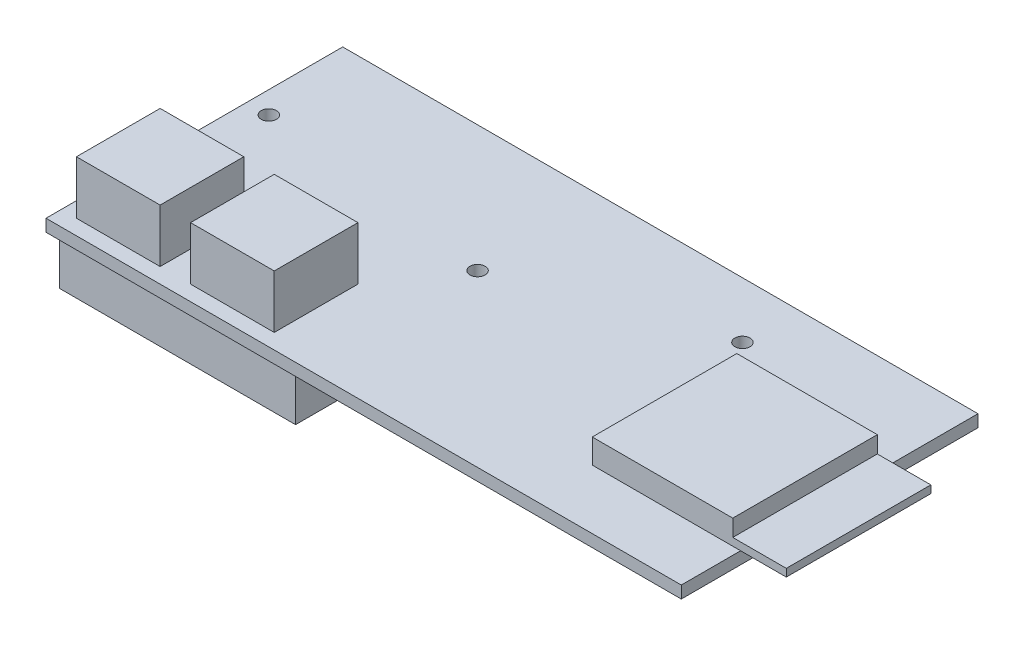
ISO-10303-21;
HEADER;
FILE_DESCRIPTION(('STEP AP214'),'2;1');
FILE_NAME('part.step','',(''),(''),'','','');
FILE_SCHEMA(('AUTOMOTIVE_DESIGN { 1 0 10303 214 1 1 1 1 }'));
ENDSEC;
DATA;
#1=APPLICATION_CONTEXT('core data for automotive mechanical design processes');
#2=APPLICATION_PROTOCOL_DEFINITION('international standard','automotive_design',2000,#1);
#3=PRODUCT_CONTEXT('',#1,'mechanical');
#4=PRODUCT('Part','Part','',(#3));
#5=PRODUCT_RELATED_PRODUCT_CATEGORY('part','',(#4));
#6=PRODUCT_DEFINITION_FORMATION('','',#4);
#7=PRODUCT_DEFINITION_CONTEXT('part definition',#1,'design');
#8=PRODUCT_DEFINITION('design','',#6,#7);
#9=PRODUCT_DEFINITION_SHAPE('','',#8);
#10=(LENGTH_UNIT() NAMED_UNIT(*) SI_UNIT(.MILLI.,.METRE.));
#11=(NAMED_UNIT(*) PLANE_ANGLE_UNIT() SI_UNIT($,.RADIAN.));
#12=(NAMED_UNIT(*) SI_UNIT($,.STERADIAN.) SOLID_ANGLE_UNIT());
#13=UNCERTAINTY_MEASURE_WITH_UNIT(LENGTH_MEASURE(1.E-05),#10,'distance_accuracy_value','');
#14=(GEOMETRIC_REPRESENTATION_CONTEXT(3) GLOBAL_UNCERTAINTY_ASSIGNED_CONTEXT((#13)) GLOBAL_UNIT_ASSIGNED_CONTEXT((#10,
#11,#12)) REPRESENTATION_CONTEXT('',''));
#15=CARTESIAN_POINT('',(0.,0.,0.));
#16=DIRECTION('',(0.,0.,1.));
#17=DIRECTION('',(1.,0.,0.));
#18=AXIS2_PLACEMENT_3D('',#15,#16,#17);
#19=CARTESIAN_POINT('',(0.,0.,0.));
#20=DIRECTION('',(0.,1.,0.));
#21=DIRECTION('',(0.,0.,1.));
#22=AXIS2_PLACEMENT_3D('',#19,#20,#21);
#23=PLANE('',#22);
#24=CARTESIAN_POINT('',(2.89,0.,12.6));
#25=DIRECTION('',(0.,1.,0.));
#26=DIRECTION('',(0.,0.,1.));
#27=AXIS2_PLACEMENT_3D('',#24,#25,#26);
#28=CIRCLE('',#27,1.);
#29=CARTESIAN_POINT('',(2.89,0.,13.6));
#30=VERTEX_POINT('',#29);
#31=EDGE_CURVE('E288',#30,#30,#28,.T.);
#32=ORIENTED_EDGE('',*,*,#31,.T.);
#33=EDGE_LOOP('',(#32));
#34=FACE_BOUND('',#33,.T.);
#35=CARTESIAN_POINT('',(34.32,0.,16.6));
#36=DIRECTION('',(0.,1.,0.));
#37=DIRECTION('',(0.,0.,1.));
#38=AXIS2_PLACEMENT_3D('',#35,#36,#37);
#39=CIRCLE('',#38,0.999999999999998);
#40=CARTESIAN_POINT('',(34.32,0.,17.6));
#41=VERTEX_POINT('',#40);
#42=EDGE_CURVE('E377',#41,#41,#39,.T.);
#43=ORIENTED_EDGE('',*,*,#42,.T.);
#44=EDGE_LOOP('',(#43));
#45=FACE_BOUND('',#44,.T.);
#46=CARTESIAN_POINT('',(59.9,0.,7.36));
#47=DIRECTION('',(0.,1.,0.));
#48=DIRECTION('',(0.,0.,1.));
#49=AXIS2_PLACEMENT_3D('',#46,#47,#48);
#50=CIRCLE('',#49,0.999999999999998);
#51=CARTESIAN_POINT('',(59.9,0.,8.36));
#52=VERTEX_POINT('',#51);
#53=EDGE_CURVE('E37',#52,#52,#50,.T.);
#54=ORIENTED_EDGE('',*,*,#53,.T.);
#55=EDGE_LOOP('',(#54));
#56=FACE_BOUND('',#55,.T.);
#57=DIRECTION('',(-1.,0.,0.));
#58=VECTOR('',#57,1.);
#59=CARTESIAN_POINT('',(-0.2,0.,37.));
#60=LINE('',#59,#58);
#61=CARTESIAN_POINT('',(30.8,0.,37.));
#62=VERTEX_POINT('',#61);
#63=CARTESIAN_POINT('',(0.,0.,37.));
#64=VERTEX_POINT('',#63);
#65=EDGE_CURVE('E51',#62,#64,#60,.T.);
#66=ORIENTED_EDGE('',*,*,#65,.F.);
#67=DIRECTION('',(0.,0.,1.));
#68=VECTOR('',#67,1.);
#69=CARTESIAN_POINT('',(30.8,0.,37.));
#70=LINE('',#69,#68);
#71=CARTESIAN_POINT('',(30.8,0.,22.));
#72=VERTEX_POINT('',#71);
#73=EDGE_CURVE('E714',#72,#62,#70,.T.);
#74=ORIENTED_EDGE('',*,*,#73,.F.);
#75=DIRECTION('',(1.,0.,0.));
#76=VECTOR('',#75,1.);
#77=CARTESIAN_POINT('',(-0.2,0.,22.));
#78=LINE('',#77,#76);
#79=CARTESIAN_POINT('',(0.,0.,22.));
#80=VERTEX_POINT('',#79);
#81=EDGE_CURVE('E11',#80,#72,#78,.T.);
#82=ORIENTED_EDGE('',*,*,#81,.F.);
#83=DIRECTION('',(0.,0.,1.));
#84=VECTOR('',#83,1.);
#85=CARTESIAN_POINT('',(0.,0.,0.));
#86=LINE('',#85,#84);
#87=CARTESIAN_POINT('',(0.,0.,0.));
#88=VERTEX_POINT('',#87);
#89=EDGE_CURVE('E356',#88,#80,#86,.T.);
#90=ORIENTED_EDGE('',*,*,#89,.F.);
#91=DIRECTION('',(-1.,0.,0.));
#92=VECTOR('',#91,1.);
#93=CARTESIAN_POINT('',(0.,0.,0.));
#94=LINE('',#93,#92);
#95=CARTESIAN_POINT('',(83.5,0.,0.));
#96=VERTEX_POINT('',#95);
#97=EDGE_CURVE('E347',#96,#88,#94,.T.);
#98=ORIENTED_EDGE('',*,*,#97,.F.);
#99=DIRECTION('',(0.,0.,-1.));
#100=VECTOR('',#99,1.);
#101=CARTESIAN_POINT('',(83.5,0.,0.));
#102=LINE('',#101,#100);
#103=CARTESIAN_POINT('',(83.5,0.,39.));
#104=VERTEX_POINT('',#103);
#105=EDGE_CURVE('E362',#104,#96,#102,.T.);
#106=ORIENTED_EDGE('',*,*,#105,.F.);
#107=DIRECTION('',(1.,0.,0.));
#108=VECTOR('',#107,1.);
#109=CARTESIAN_POINT('',(0.,0.,39.));
#110=LINE('',#109,#108);
#111=CARTESIAN_POINT('',(0.,0.,39.));
#112=VERTEX_POINT('',#111);
#113=EDGE_CURVE('E359',#112,#104,#110,.T.);
#114=ORIENTED_EDGE('',*,*,#113,.F.);
#115=EDGE_CURVE('E56',#64,#112,#86,.T.);
#116=ORIENTED_EDGE('',*,*,#115,.F.);
#117=EDGE_LOOP('',(#66,#74,#82,#90,#98,#106,#114,#116));
#118=FACE_BOUND('',#117,.T.);
#119=ADVANCED_FACE('F33',(#34,#45,#56,#118),#23,.F.);
#120=CARTESIAN_POINT('',(0.,1.6,0.));
#121=DIRECTION('',(0.,1.,0.));
#122=DIRECTION('',(0.,0.,1.));
#123=AXIS2_PLACEMENT_3D('',#120,#121,#122);
#124=PLANE('',#123);
#125=CARTESIAN_POINT('',(59.9,1.6,7.36));
#126=DIRECTION('',(0.,1.,0.));
#127=DIRECTION('',(0.,0.,1.));
#128=AXIS2_PLACEMENT_3D('',#125,#126,#127);
#129=CIRCLE('',#128,0.999999999999998);
#130=CARTESIAN_POINT('',(59.9,1.6,8.36));
#131=VERTEX_POINT('',#130);
#132=EDGE_CURVE('E285',#131,#131,#129,.T.);
#133=ORIENTED_EDGE('',*,*,#132,.F.);
#134=EDGE_LOOP('',(#133));
#135=FACE_BOUND('',#134,.T.);
#136=CARTESIAN_POINT('',(34.32,1.6,16.6));
#137=DIRECTION('',(0.,1.,0.));
#138=DIRECTION('',(0.,0.,1.));
#139=AXIS2_PLACEMENT_3D('',#136,#137,#138);
#140=CIRCLE('',#139,0.999999999999998);
#141=CARTESIAN_POINT('',(34.32,1.6,17.6));
#142=VERTEX_POINT('',#141);
#143=EDGE_CURVE('E289',#142,#142,#140,.T.);
#144=ORIENTED_EDGE('',*,*,#143,.F.);
#145=EDGE_LOOP('',(#144));
#146=FACE_BOUND('',#145,.T.);
#147=CARTESIAN_POINT('',(2.89,1.6,12.6));
#148=DIRECTION('',(0.,1.,0.));
#149=DIRECTION('',(0.,0.,1.));
#150=AXIS2_PLACEMENT_3D('',#147,#148,#149);
#151=CIRCLE('',#150,1.);
#152=CARTESIAN_POINT('',(2.89,1.6,13.6));
#153=VERTEX_POINT('',#152);
#154=EDGE_CURVE('E284',#153,#153,#151,.T.);
#155=ORIENTED_EDGE('',*,*,#154,.F.);
#156=EDGE_LOOP('',(#155));
#157=FACE_BOUND('',#156,.T.);
#158=DIRECTION('',(-1.,0.,0.));
#159=VECTOR('',#158,1.);
#160=CARTESIAN_POINT('',(64.,1.6,12.2));
#161=LINE('',#160,#159);
#162=CARTESIAN_POINT('',(83.5,1.6,12.2));
#163=VERTEX_POINT('',#162);
#164=CARTESIAN_POINT('',(64.,1.6,12.2));
#165=VERTEX_POINT('',#164);
#166=EDGE_CURVE('E42',#163,#165,#161,.T.);
#167=ORIENTED_EDGE('',*,*,#166,.F.);
#168=DIRECTION('',(0.,0.,-1.));
#169=VECTOR('',#168,1.);
#170=CARTESIAN_POINT('',(83.5,1.6,0.));
#171=LINE('',#170,#169);
#172=CARTESIAN_POINT('',(83.5,1.6,0.));
#173=VERTEX_POINT('',#172);
#174=EDGE_CURVE('E349',#163,#173,#171,.T.);
#175=ORIENTED_EDGE('',*,*,#174,.T.);
#176=DIRECTION('',(-1.,0.,0.));
#177=VECTOR('',#176,1.);
#178=CARTESIAN_POINT('',(0.,1.6,0.));
#179=LINE('',#178,#177);
#180=CARTESIAN_POINT('',(0.,1.6,0.));
#181=VERTEX_POINT('',#180);
#182=EDGE_CURVE('E352',#173,#181,#179,.T.);
#183=ORIENTED_EDGE('',*,*,#182,.T.);
#184=DIRECTION('',(0.,0.,1.));
#185=VECTOR('',#184,1.);
#186=CARTESIAN_POINT('',(0.,1.6,0.));
#187=LINE('',#186,#185);
#188=CARTESIAN_POINT('',(0.,1.6,39.));
#189=VERTEX_POINT('',#188);
#190=EDGE_CURVE('E343',#181,#189,#187,.T.);
#191=ORIENTED_EDGE('',*,*,#190,.T.);
#192=DIRECTION('',(1.,0.,0.));
#193=VECTOR('',#192,1.);
#194=CARTESIAN_POINT('',(0.,1.6,39.));
#195=LINE('',#194,#193);
#196=CARTESIAN_POINT('',(83.5,1.6,39.));
#197=VERTEX_POINT('',#196);
#198=EDGE_CURVE('E346',#189,#197,#195,.T.);
#199=ORIENTED_EDGE('',*,*,#198,.T.);
#200=CARTESIAN_POINT('',(83.5,1.6,31.2));
#201=VERTEX_POINT('',#200);
#202=EDGE_CURVE('E350',#197,#201,#171,.T.);
#203=ORIENTED_EDGE('',*,*,#202,.T.);
#204=DIRECTION('',(1.,0.,0.));
#205=VECTOR('',#204,1.);
#206=CARTESIAN_POINT('',(64.,1.6,31.2));
#207=LINE('',#206,#205);
#208=CARTESIAN_POINT('',(64.,1.6,31.2));
#209=VERTEX_POINT('',#208);
#210=EDGE_CURVE('E325',#209,#201,#207,.T.);
#211=ORIENTED_EDGE('',*,*,#210,.F.);
#212=DIRECTION('',(0.,0.,1.));
#213=VECTOR('',#212,1.);
#214=CARTESIAN_POINT('',(64.,1.6,12.2));
#215=LINE('',#214,#213);
#216=EDGE_CURVE('E313',#165,#209,#215,.T.);
#217=ORIENTED_EDGE('',*,*,#216,.F.);
#218=EDGE_LOOP('',(#167,#175,#183,#191,#199,#203,#211,#217));
#219=FACE_BOUND('',#218,.T.);
#220=DIRECTION('',(1.,0.,0.));
#221=VECTOR('',#220,1.);
#222=CARTESIAN_POINT('',(2.,1.6,37.));
#223=LINE('',#222,#221);
#224=CARTESIAN_POINT('',(2.,1.6,37.));
#225=VERTEX_POINT('',#224);
#226=CARTESIAN_POINT('',(13.,1.6,37.));
#227=VERTEX_POINT('',#226);
#228=EDGE_CURVE('E269',#225,#227,#223,.T.);
#229=ORIENTED_EDGE('',*,*,#228,.F.);
#230=DIRECTION('',(0.,0.,1.));
#231=VECTOR('',#230,1.);
#232=CARTESIAN_POINT('',(2.,1.6,26.));
#233=LINE('',#232,#231);
#234=CARTESIAN_POINT('',(2.,1.6,26.));
#235=VERTEX_POINT('',#234);
#236=EDGE_CURVE('E255',#235,#225,#233,.T.);
#237=ORIENTED_EDGE('',*,*,#236,.F.);
#238=DIRECTION('',(-1.,0.,0.));
#239=VECTOR('',#238,1.);
#240=CARTESIAN_POINT('',(2.,1.6,26.));
#241=LINE('',#240,#239);
#242=CARTESIAN_POINT('',(13.,1.6,26.));
#243=VERTEX_POINT('',#242);
#244=EDGE_CURVE('E260',#243,#235,#241,.T.);
#245=ORIENTED_EDGE('',*,*,#244,.F.);
#246=DIRECTION('',(0.,0.,-1.));
#247=VECTOR('',#246,1.);
#248=CARTESIAN_POINT('',(13.,1.6,26.));
#249=LINE('',#248,#247);
#250=EDGE_CURVE('E271',#227,#243,#249,.T.);
#251=ORIENTED_EDGE('',*,*,#250,.F.);
#252=EDGE_LOOP('',(#229,#237,#245,#251));
#253=FACE_BOUND('',#252,.T.);
#254=DIRECTION('',(1.,0.,0.));
#255=VECTOR('',#254,1.);
#256=CARTESIAN_POINT('',(17.,1.6,37.));
#257=LINE('',#256,#255);
#258=CARTESIAN_POINT('',(17.,1.6,37.));
#259=VERTEX_POINT('',#258);
#260=CARTESIAN_POINT('',(28.,1.6,37.));
#261=VERTEX_POINT('',#260);
#262=EDGE_CURVE('E224',#259,#261,#257,.T.);
#263=ORIENTED_EDGE('',*,*,#262,.F.);
#264=DIRECTION('',(0.,0.,1.));
#265=VECTOR('',#264,1.);
#266=CARTESIAN_POINT('',(17.,1.6,26.));
#267=LINE('',#266,#265);
#268=CARTESIAN_POINT('',(17.,1.6,26.));
#269=VERTEX_POINT('',#268);
#270=EDGE_CURVE('E221',#269,#259,#267,.T.);
#271=ORIENTED_EDGE('',*,*,#270,.F.);
#272=DIRECTION('',(-1.,0.,0.));
#273=VECTOR('',#272,1.);
#274=CARTESIAN_POINT('',(17.,1.6,26.));
#275=LINE('',#274,#273);
#276=CARTESIAN_POINT('',(28.,1.6,26.));
#277=VERTEX_POINT('',#276);
#278=EDGE_CURVE('E234',#277,#269,#275,.T.);
#279=ORIENTED_EDGE('',*,*,#278,.F.);
#280=DIRECTION('',(0.,0.,-1.));
#281=VECTOR('',#280,1.);
#282=CARTESIAN_POINT('',(28.,1.6,26.));
#283=LINE('',#282,#281);
#284=EDGE_CURVE('E242',#261,#277,#283,.T.);
#285=ORIENTED_EDGE('',*,*,#284,.F.);
#286=EDGE_LOOP('',(#263,#271,#279,#285));
#287=FACE_BOUND('',#286,.T.);
#288=ADVANCED_FACE('F402',(#135,#146,#157,#219,#253,#287),#124,.T.);
#289=CARTESIAN_POINT('',(0.,1.6,0.));
#290=DIRECTION('',(1.,0.,0.));
#291=DIRECTION('',(0.,0.,-1.));
#292=AXIS2_PLACEMENT_3D('',#289,#290,#291);
#293=PLANE('',#292);
#294=ORIENTED_EDGE('',*,*,#89,.T.);
#295=EDGE_CURVE('E360',#80,#64,#86,.T.);
#296=ORIENTED_EDGE('',*,*,#295,.T.);
#297=ORIENTED_EDGE('',*,*,#115,.T.);
#298=DIRECTION('',(0.,-1.,0.));
#299=VECTOR('',#298,1.);
#300=CARTESIAN_POINT('',(0.,1.6,39.));
#301=LINE('',#300,#299);
#302=EDGE_CURVE('E373',#189,#112,#301,.T.);
#303=ORIENTED_EDGE('',*,*,#302,.F.);
#304=ORIENTED_EDGE('',*,*,#190,.F.);
#305=DIRECTION('',(0.,-1.,0.));
#306=VECTOR('',#305,1.);
#307=CARTESIAN_POINT('',(0.,1.6,0.));
#308=LINE('',#307,#306);
#309=EDGE_CURVE('E355',#181,#88,#308,.T.);
#310=ORIENTED_EDGE('',*,*,#309,.T.);
#311=EDGE_LOOP('',(#294,#296,#297,#303,#304,#310));
#312=FACE_BOUND('',#311,.T.);
#313=ADVANCED_FACE('F35',(#312),#293,.F.);
#314=CARTESIAN_POINT('',(0.,1.6,39.));
#315=DIRECTION('',(0.,0.,-1.));
#316=DIRECTION('',(-1.,0.,0.));
#317=AXIS2_PLACEMENT_3D('',#314,#315,#316);
#318=PLANE('',#317);
#319=ORIENTED_EDGE('',*,*,#113,.T.);
#320=DIRECTION('',(0.,-1.,0.));
#321=VECTOR('',#320,1.);
#322=CARTESIAN_POINT('',(83.5,1.6,39.));
#323=LINE('',#322,#321);
#324=EDGE_CURVE('E370',#197,#104,#323,.T.);
#325=ORIENTED_EDGE('',*,*,#324,.F.);
#326=ORIENTED_EDGE('',*,*,#198,.F.);
#327=ORIENTED_EDGE('',*,*,#302,.T.);
#328=EDGE_LOOP('',(#319,#325,#326,#327));
#329=FACE_BOUND('',#328,.T.);
#330=ADVANCED_FACE('F419',(#329),#318,.F.);
#331=CARTESIAN_POINT('',(83.5,1.6,0.));
#332=DIRECTION('',(-1.,0.,0.));
#333=DIRECTION('',(0.,0.,1.));
#334=AXIS2_PLACEMENT_3D('',#331,#332,#333);
#335=PLANE('',#334);
#336=ORIENTED_EDGE('',*,*,#105,.T.);
#337=DIRECTION('',(0.,-1.,0.));
#338=VECTOR('',#337,1.);
#339=CARTESIAN_POINT('',(83.5,1.6,0.));
#340=LINE('',#339,#338);
#341=EDGE_CURVE('E367',#173,#96,#340,.T.);
#342=ORIENTED_EDGE('',*,*,#341,.F.);
#343=ORIENTED_EDGE('',*,*,#174,.F.);
#344=EDGE_CURVE('E353',#201,#163,#171,.T.);
#345=ORIENTED_EDGE('',*,*,#344,.F.);
#346=ORIENTED_EDGE('',*,*,#202,.F.);
#347=ORIENTED_EDGE('',*,*,#324,.T.);
#348=EDGE_LOOP('',(#336,#342,#343,#345,#346,#347));
#349=FACE_BOUND('',#348,.T.);
#350=ADVANCED_FACE('F416',(#349),#335,.F.);
#351=CARTESIAN_POINT('',(0.,1.6,0.));
#352=DIRECTION('',(0.,0.,1.));
#353=DIRECTION('',(1.,0.,0.));
#354=AXIS2_PLACEMENT_3D('',#351,#352,#353);
#355=PLANE('',#354);
#356=ORIENTED_EDGE('',*,*,#97,.T.);
#357=ORIENTED_EDGE('',*,*,#309,.F.);
#358=ORIENTED_EDGE('',*,*,#182,.F.);
#359=ORIENTED_EDGE('',*,*,#341,.T.);
#360=EDGE_LOOP('',(#356,#357,#358,#359));
#361=FACE_BOUND('',#360,.T.);
#362=ADVANCED_FACE('F412',(#361),#355,.F.);
#363=CARTESIAN_POINT('',(0.,1.6,0.));
#364=DIRECTION('',(0.,1.,0.));
#365=DIRECTION('',(0.,0.,1.));
#366=AXIS2_PLACEMENT_3D('',#363,#364,#365);
#367=PLANE('',#366);
#368=CARTESIAN_POINT('',(89.5,1.6,31.2));
#369=VERTEX_POINT('',#368);
#370=EDGE_CURVE('E324',#201,#369,#207,.T.);
#371=ORIENTED_EDGE('',*,*,#370,.F.);
#372=ORIENTED_EDGE('',*,*,#344,.T.);
#373=CARTESIAN_POINT('',(89.5,1.6,12.2));
#374=VERTEX_POINT('',#373);
#375=EDGE_CURVE('E317',#374,#163,#161,.T.);
#376=ORIENTED_EDGE('',*,*,#375,.F.);
#377=DIRECTION('',(0.,0.,-1.));
#378=VECTOR('',#377,1.);
#379=CARTESIAN_POINT('',(89.5,1.6,12.2));
#380=LINE('',#379,#378);
#381=EDGE_CURVE('E328',#369,#374,#380,.T.);
#382=ORIENTED_EDGE('',*,*,#381,.F.);
#383=EDGE_LOOP('',(#371,#372,#376,#382));
#384=FACE_BOUND('',#383,.T.);
#385=ADVANCED_FACE('F415',(#384),#367,.F.);
#386=CARTESIAN_POINT('',(64.,2.6,12.2));
#387=DIRECTION('',(1.,0.,0.));
#388=DIRECTION('',(0.,0.,-1.));
#389=AXIS2_PLACEMENT_3D('',#386,#387,#388);
#390=PLANE('',#389);
#391=ORIENTED_EDGE('',*,*,#216,.T.);
#392=DIRECTION('',(0.,-1.,0.));
#393=VECTOR('',#392,1.);
#394=CARTESIAN_POINT('',(64.,2.6,31.2));
#395=LINE('',#394,#393);
#396=CARTESIAN_POINT('',(64.,4.8,31.2));
#397=VERTEX_POINT('',#396);
#398=EDGE_CURVE('E340',#397,#209,#395,.T.);
#399=ORIENTED_EDGE('',*,*,#398,.F.);
#400=DIRECTION('',(0.,0.,1.));
#401=VECTOR('',#400,1.);
#402=CARTESIAN_POINT('',(64.,4.8,12.2));
#403=LINE('',#402,#401);
#404=CARTESIAN_POINT('',(64.,4.8,12.2));
#405=VERTEX_POINT('',#404);
#406=EDGE_CURVE('E294',#405,#397,#403,.T.);
#407=ORIENTED_EDGE('',*,*,#406,.F.);
#408=DIRECTION('',(0.,-1.,0.));
#409=VECTOR('',#408,1.);
#410=CARTESIAN_POINT('',(64.,2.6,12.2));
#411=LINE('',#410,#409);
#412=EDGE_CURVE('E321',#405,#165,#411,.T.);
#413=ORIENTED_EDGE('',*,*,#412,.T.);
#414=EDGE_LOOP('',(#391,#399,#407,#413));
#415=FACE_BOUND('',#414,.T.);
#416=ADVANCED_FACE('F462',(#415),#390,.F.);
#417=CARTESIAN_POINT('',(64.,2.6,31.2));
#418=DIRECTION('',(0.,0.,-1.));
#419=DIRECTION('',(-1.,0.,0.));
#420=AXIS2_PLACEMENT_3D('',#417,#418,#419);
#421=PLANE('',#420);
#422=ORIENTED_EDGE('',*,*,#210,.T.);
#423=ORIENTED_EDGE('',*,*,#370,.T.);
#424=DIRECTION('',(0.,-1.,0.));
#425=VECTOR('',#424,1.);
#426=CARTESIAN_POINT('',(89.5,2.6,31.2));
#427=LINE('',#426,#425);
#428=CARTESIAN_POINT('',(89.5,2.6,31.2));
#429=VERTEX_POINT('',#428);
#430=EDGE_CURVE('E337',#429,#369,#427,.T.);
#431=ORIENTED_EDGE('',*,*,#430,.F.);
#432=DIRECTION('',(1.,0.,0.));
#433=VECTOR('',#432,1.);
#434=CARTESIAN_POINT('',(64.,2.6,31.2));
#435=LINE('',#434,#433);
#436=CARTESIAN_POINT('',(82.46673710251,2.6,31.2));
#437=VERTEX_POINT('',#436);
#438=EDGE_CURVE('E314',#437,#429,#435,.T.);
#439=ORIENTED_EDGE('',*,*,#438,.F.);
#440=DIRECTION('',(0.,-1.,0.));
#441=VECTOR('',#440,1.);
#442=CARTESIAN_POINT('',(82.46673710251,4.8,31.2));
#443=LINE('',#442,#441);
#444=CARTESIAN_POINT('',(82.46673710251,4.8,31.2));
#445=VERTEX_POINT('',#444);
#446=EDGE_CURVE('E310',#445,#437,#443,.T.);
#447=ORIENTED_EDGE('',*,*,#446,.F.);
#448=DIRECTION('',(1.,0.,0.));
#449=VECTOR('',#448,1.);
#450=CARTESIAN_POINT('',(64.,4.8,31.2));
#451=LINE('',#450,#449);
#452=EDGE_CURVE('E297',#397,#445,#451,.T.);
#453=ORIENTED_EDGE('',*,*,#452,.F.);
#454=ORIENTED_EDGE('',*,*,#398,.T.);
#455=EDGE_LOOP('',(#422,#423,#431,#439,#447,#453,#454));
#456=FACE_BOUND('',#455,.T.);
#457=ADVANCED_FACE('F458',(#456),#421,.F.);
#458=CARTESIAN_POINT('',(89.5,2.6,12.2));
#459=DIRECTION('',(-1.,0.,0.));
#460=DIRECTION('',(0.,0.,1.));
#461=AXIS2_PLACEMENT_3D('',#458,#459,#460);
#462=PLANE('',#461);
#463=ORIENTED_EDGE('',*,*,#381,.T.);
#464=DIRECTION('',(0.,-1.,0.));
#465=VECTOR('',#464,1.);
#466=CARTESIAN_POINT('',(89.5,2.6,12.2));
#467=LINE('',#466,#465);
#468=CARTESIAN_POINT('',(89.5,2.6,12.2));
#469=VERTEX_POINT('',#468);
#470=EDGE_CURVE('E334',#469,#374,#467,.T.);
#471=ORIENTED_EDGE('',*,*,#470,.F.);
#472=DIRECTION('',(0.,0.,-1.));
#473=VECTOR('',#472,1.);
#474=CARTESIAN_POINT('',(89.5,2.6,12.2));
#475=LINE('',#474,#473);
#476=EDGE_CURVE('E316',#429,#469,#475,.T.);
#477=ORIENTED_EDGE('',*,*,#476,.F.);
#478=ORIENTED_EDGE('',*,*,#430,.T.);
#479=EDGE_LOOP('',(#463,#471,#477,#478));
#480=FACE_BOUND('',#479,.T.);
#481=ADVANCED_FACE('F454',(#480),#462,.F.);
#482=CARTESIAN_POINT('',(64.,2.6,12.2));
#483=DIRECTION('',(0.,0.,1.));
#484=DIRECTION('',(1.,0.,0.));
#485=AXIS2_PLACEMENT_3D('',#482,#483,#484);
#486=PLANE('',#485);
#487=ORIENTED_EDGE('',*,*,#375,.T.);
#488=ORIENTED_EDGE('',*,*,#166,.T.);
#489=ORIENTED_EDGE('',*,*,#412,.F.);
#490=DIRECTION('',(-1.,0.,0.));
#491=VECTOR('',#490,1.);
#492=CARTESIAN_POINT('',(64.,4.8,12.2));
#493=LINE('',#492,#491);
#494=CARTESIAN_POINT('',(82.46673710251,4.8,12.2));
#495=VERTEX_POINT('',#494);
#496=EDGE_CURVE('E302',#495,#405,#493,.T.);
#497=ORIENTED_EDGE('',*,*,#496,.F.);
#498=DIRECTION('',(0.,-1.,0.));
#499=VECTOR('',#498,1.);
#500=CARTESIAN_POINT('',(82.46673710251,4.8,12.2));
#501=LINE('',#500,#499);
#502=CARTESIAN_POINT('',(82.46673710251,2.6,12.2));
#503=VERTEX_POINT('',#502);
#504=EDGE_CURVE('E305',#495,#503,#501,.T.);
#505=ORIENTED_EDGE('',*,*,#504,.T.);
#506=DIRECTION('',(-1.,0.,0.));
#507=VECTOR('',#506,1.);
#508=CARTESIAN_POINT('',(64.,2.6,12.2));
#509=LINE('',#508,#507);
#510=EDGE_CURVE('E319',#469,#503,#509,.T.);
#511=ORIENTED_EDGE('',*,*,#510,.F.);
#512=ORIENTED_EDGE('',*,*,#470,.T.);
#513=EDGE_LOOP('',(#487,#488,#489,#497,#505,#511,#512));
#514=FACE_BOUND('',#513,.T.);
#515=ADVANCED_FACE('F449',(#514),#486,.F.);
#516=CARTESIAN_POINT('',(0.,2.6,0.));
#517=DIRECTION('',(0.,1.,0.));
#518=DIRECTION('',(0.,0.,1.));
#519=AXIS2_PLACEMENT_3D('',#516,#517,#518);
#520=PLANE('',#519);
#521=DIRECTION('',(0.,0.,-1.));
#522=VECTOR('',#521,1.);
#523=CARTESIAN_POINT('',(82.46673710251,2.6,12.2));
#524=LINE('',#523,#522);
#525=EDGE_CURVE('E298',#437,#503,#524,.T.);
#526=ORIENTED_EDGE('',*,*,#525,.F.);
#527=ORIENTED_EDGE('',*,*,#438,.T.);
#528=ORIENTED_EDGE('',*,*,#476,.T.);
#529=ORIENTED_EDGE('',*,*,#510,.T.);
#530=EDGE_LOOP('',(#526,#527,#528,#529));
#531=FACE_BOUND('',#530,.T.);
#532=ADVANCED_FACE('F472',(#531),#520,.T.);
#533=CARTESIAN_POINT('',(82.46673710251,4.8,12.2));
#534=DIRECTION('',(-1.,0.,0.));
#535=DIRECTION('',(0.,0.,1.));
#536=AXIS2_PLACEMENT_3D('',#533,#534,#535);
#537=PLANE('',#536);
#538=ORIENTED_EDGE('',*,*,#525,.T.);
#539=ORIENTED_EDGE('',*,*,#504,.F.);
#540=DIRECTION('',(0.,0.,-1.));
#541=VECTOR('',#540,1.);
#542=CARTESIAN_POINT('',(82.46673710251,4.8,12.2));
#543=LINE('',#542,#541);
#544=EDGE_CURVE('E300',#445,#495,#543,.T.);
#545=ORIENTED_EDGE('',*,*,#544,.F.);
#546=ORIENTED_EDGE('',*,*,#446,.T.);
#547=EDGE_LOOP('',(#538,#539,#545,#546));
#548=FACE_BOUND('',#547,.T.);
#549=ADVANCED_FACE('F470',(#548),#537,.F.);
#550=CARTESIAN_POINT('',(0.,4.8,0.));
#551=DIRECTION('',(0.,1.,0.));
#552=DIRECTION('',(0.,0.,1.));
#553=AXIS2_PLACEMENT_3D('',#550,#551,#552);
#554=PLANE('',#553);
#555=ORIENTED_EDGE('',*,*,#406,.T.);
#556=ORIENTED_EDGE('',*,*,#452,.T.);
#557=ORIENTED_EDGE('',*,*,#544,.T.);
#558=ORIENTED_EDGE('',*,*,#496,.T.);
#559=EDGE_LOOP('',(#555,#556,#557,#558));
#560=FACE_BOUND('',#559,.T.);
#561=ADVANCED_FACE('F466',(#560),#554,.T.);
#562=CARTESIAN_POINT('',(2.89,-0.6,12.6));
#563=DIRECTION('',(0.,1.,0.));
#564=DIRECTION('',(0.,0.,1.));
#565=AXIS2_PLACEMENT_3D('',#562,#563,#564);
#566=CYLINDRICAL_SURFACE('',#565,1.);
#567=ORIENTED_EDGE('',*,*,#154,.T.);
#568=EDGE_LOOP('',(#567));
#569=FACE_BOUND('',#568,.T.);
#570=ORIENTED_EDGE('',*,*,#31,.F.);
#571=EDGE_LOOP('',(#570));
#572=FACE_BOUND('',#571,.T.);
#573=ADVANCED_FACE('F398',(#569,#572),#566,.F.);
#574=CARTESIAN_POINT('',(34.32,-0.6,16.6));
#575=DIRECTION('',(0.,1.,0.));
#576=DIRECTION('',(0.,0.,1.));
#577=AXIS2_PLACEMENT_3D('',#574,#575,#576);
#578=CYLINDRICAL_SURFACE('',#577,0.999999999999998);
#579=ORIENTED_EDGE('',*,*,#143,.T.);
#580=EDGE_LOOP('',(#579));
#581=FACE_BOUND('',#580,.T.);
#582=ORIENTED_EDGE('',*,*,#42,.F.);
#583=EDGE_LOOP('',(#582));
#584=FACE_BOUND('',#583,.T.);
#585=ADVANCED_FACE('F388',(#581,#584),#578,.F.);
#586=CARTESIAN_POINT('',(59.9,-0.6,7.36));
#587=DIRECTION('',(0.,1.,0.));
#588=DIRECTION('',(0.,0.,1.));
#589=AXIS2_PLACEMENT_3D('',#586,#587,#588);
#590=CYLINDRICAL_SURFACE('',#589,0.999999999999998);
#591=ORIENTED_EDGE('',*,*,#132,.T.);
#592=EDGE_LOOP('',(#591));
#593=FACE_BOUND('',#592,.T.);
#594=ORIENTED_EDGE('',*,*,#53,.F.);
#595=EDGE_LOOP('',(#594));
#596=FACE_BOUND('',#595,.T.);
#597=ADVANCED_FACE('F385',(#593,#596),#590,.F.);
#598=CARTESIAN_POINT('',(2.,8.6,26.));
#599=DIRECTION('',(1.,0.,0.));
#600=DIRECTION('',(0.,0.,-1.));
#601=AXIS2_PLACEMENT_3D('',#598,#599,#600);
#602=PLANE('',#601);
#603=ORIENTED_EDGE('',*,*,#236,.T.);
#604=DIRECTION('',(0.,-1.,0.));
#605=VECTOR('',#604,1.);
#606=CARTESIAN_POINT('',(2.,8.6,37.));
#607=LINE('',#606,#605);
#608=CARTESIAN_POINT('',(2.,8.6,37.));
#609=VERTEX_POINT('',#608);
#610=EDGE_CURVE('E282',#609,#225,#607,.T.);
#611=ORIENTED_EDGE('',*,*,#610,.F.);
#612=DIRECTION('',(0.,0.,1.));
#613=VECTOR('',#612,1.);
#614=CARTESIAN_POINT('',(2.,8.6,26.));
#615=LINE('',#614,#613);
#616=CARTESIAN_POINT('',(2.,8.6,26.));
#617=VERTEX_POINT('',#616);
#618=EDGE_CURVE('E256',#617,#609,#615,.T.);
#619=ORIENTED_EDGE('',*,*,#618,.F.);
#620=DIRECTION('',(0.,-1.,0.));
#621=VECTOR('',#620,1.);
#622=CARTESIAN_POINT('',(2.,8.6,26.));
#623=LINE('',#622,#621);
#624=EDGE_CURVE('E266',#617,#235,#623,.T.);
#625=ORIENTED_EDGE('',*,*,#624,.T.);
#626=EDGE_LOOP('',(#603,#611,#619,#625));
#627=FACE_BOUND('',#626,.T.);
#628=ADVANCED_FACE('F387',(#627),#602,.F.);
#629=CARTESIAN_POINT('',(2.,8.6,37.));
#630=DIRECTION('',(0.,0.,-1.));
#631=DIRECTION('',(-1.,0.,0.));
#632=AXIS2_PLACEMENT_3D('',#629,#630,#631);
#633=PLANE('',#632);
#634=ORIENTED_EDGE('',*,*,#228,.T.);
#635=DIRECTION('',(0.,-1.,0.));
#636=VECTOR('',#635,1.);
#637=CARTESIAN_POINT('',(13.,8.6,37.));
#638=LINE('',#637,#636);
#639=CARTESIAN_POINT('',(13.,8.6,37.));
#640=VERTEX_POINT('',#639);
#641=EDGE_CURVE('E279',#640,#227,#638,.T.);
#642=ORIENTED_EDGE('',*,*,#641,.F.);
#643=DIRECTION('',(1.,0.,0.));
#644=VECTOR('',#643,1.);
#645=CARTESIAN_POINT('',(2.,8.6,37.));
#646=LINE('',#645,#644);
#647=EDGE_CURVE('E259',#609,#640,#646,.T.);
#648=ORIENTED_EDGE('',*,*,#647,.F.);
#649=ORIENTED_EDGE('',*,*,#610,.T.);
#650=EDGE_LOOP('',(#634,#642,#648,#649));
#651=FACE_BOUND('',#650,.T.);
#652=ADVANCED_FACE('F395',(#651),#633,.F.);
#653=CARTESIAN_POINT('',(13.,8.6,26.));
#654=DIRECTION('',(-1.,0.,0.));
#655=DIRECTION('',(0.,0.,1.));
#656=AXIS2_PLACEMENT_3D('',#653,#654,#655);
#657=PLANE('',#656);
#658=ORIENTED_EDGE('',*,*,#250,.T.);
#659=DIRECTION('',(0.,-1.,0.));
#660=VECTOR('',#659,1.);
#661=CARTESIAN_POINT('',(13.,8.6,26.));
#662=LINE('',#661,#660);
#663=CARTESIAN_POINT('',(13.,8.6,26.));
#664=VERTEX_POINT('',#663);
#665=EDGE_CURVE('E277',#664,#243,#662,.T.);
#666=ORIENTED_EDGE('',*,*,#665,.F.);
#667=DIRECTION('',(0.,0.,-1.));
#668=VECTOR('',#667,1.);
#669=CARTESIAN_POINT('',(13.,8.6,26.));
#670=LINE('',#669,#668);
#671=EDGE_CURVE('E262',#640,#664,#670,.T.);
#672=ORIENTED_EDGE('',*,*,#671,.F.);
#673=ORIENTED_EDGE('',*,*,#641,.T.);
#674=EDGE_LOOP('',(#658,#666,#672,#673));
#675=FACE_BOUND('',#674,.T.);
#676=ADVANCED_FACE('F563',(#675),#657,.F.);
#677=CARTESIAN_POINT('',(2.,8.6,26.));
#678=DIRECTION('',(0.,0.,1.));
#679=DIRECTION('',(1.,0.,0.));
#680=AXIS2_PLACEMENT_3D('',#677,#678,#679);
#681=PLANE('',#680);
#682=ORIENTED_EDGE('',*,*,#244,.T.);
#683=ORIENTED_EDGE('',*,*,#624,.F.);
#684=DIRECTION('',(-1.,0.,0.));
#685=VECTOR('',#684,1.);
#686=CARTESIAN_POINT('',(2.,8.6,26.));
#687=LINE('',#686,#685);
#688=EDGE_CURVE('E264',#664,#617,#687,.T.);
#689=ORIENTED_EDGE('',*,*,#688,.F.);
#690=ORIENTED_EDGE('',*,*,#665,.T.);
#691=EDGE_LOOP('',(#682,#683,#689,#690));
#692=FACE_BOUND('',#691,.T.);
#693=ADVANCED_FACE('F573',(#692),#681,.F.);
#694=CARTESIAN_POINT('',(0.,8.6,0.));
#695=DIRECTION('',(0.,1.,0.));
#696=DIRECTION('',(0.,0.,1.));
#697=AXIS2_PLACEMENT_3D('',#694,#695,#696);
#698=PLANE('',#697);
#699=ORIENTED_EDGE('',*,*,#618,.T.);
#700=ORIENTED_EDGE('',*,*,#647,.T.);
#701=ORIENTED_EDGE('',*,*,#671,.T.);
#702=ORIENTED_EDGE('',*,*,#688,.T.);
#703=EDGE_LOOP('',(#699,#700,#701,#702));
#704=FACE_BOUND('',#703,.T.);
#705=ADVANCED_FACE('F583',(#704),#698,.T.);
#706=CARTESIAN_POINT('',(17.,8.6,26.));
#707=DIRECTION('',(1.,0.,0.));
#708=DIRECTION('',(0.,0.,-1.));
#709=AXIS2_PLACEMENT_3D('',#706,#707,#708);
#710=PLANE('',#709);
#711=ORIENTED_EDGE('',*,*,#270,.T.);
#712=DIRECTION('',(0.,-1.,0.));
#713=VECTOR('',#712,1.);
#714=CARTESIAN_POINT('',(17.,8.6,37.));
#715=LINE('',#714,#713);
#716=CARTESIAN_POINT('',(17.,8.6,37.));
#717=VERTEX_POINT('',#716);
#718=EDGE_CURVE('E253',#717,#259,#715,.T.);
#719=ORIENTED_EDGE('',*,*,#718,.F.);
#720=DIRECTION('',(0.,0.,1.));
#721=VECTOR('',#720,1.);
#722=CARTESIAN_POINT('',(17.,8.6,26.));
#723=LINE('',#722,#721);
#724=CARTESIAN_POINT('',(17.,8.6,26.));
#725=VERTEX_POINT('',#724);
#726=EDGE_CURVE('E230',#725,#717,#723,.T.);
#727=ORIENTED_EDGE('',*,*,#726,.F.);
#728=DIRECTION('',(0.,-1.,0.));
#729=VECTOR('',#728,1.);
#730=CARTESIAN_POINT('',(17.,8.6,26.));
#731=LINE('',#730,#729);
#732=EDGE_CURVE('E239',#725,#269,#731,.T.);
#733=ORIENTED_EDGE('',*,*,#732,.T.);
#734=EDGE_LOOP('',(#711,#719,#727,#733));
#735=FACE_BOUND('',#734,.T.);
#736=ADVANCED_FACE('F593',(#735),#710,.F.);
#737=CARTESIAN_POINT('',(17.,8.6,37.));
#738=DIRECTION('',(0.,0.,-1.));
#739=DIRECTION('',(-1.,0.,0.));
#740=AXIS2_PLACEMENT_3D('',#737,#738,#739);
#741=PLANE('',#740);
#742=ORIENTED_EDGE('',*,*,#262,.T.);
#743=DIRECTION('',(0.,-1.,0.));
#744=VECTOR('',#743,1.);
#745=CARTESIAN_POINT('',(28.,8.6,37.));
#746=LINE('',#745,#744);
#747=CARTESIAN_POINT('',(28.,8.6,37.));
#748=VERTEX_POINT('',#747);
#749=EDGE_CURVE('E250',#748,#261,#746,.T.);
#750=ORIENTED_EDGE('',*,*,#749,.F.);
#751=DIRECTION('',(1.,0.,0.));
#752=VECTOR('',#751,1.);
#753=CARTESIAN_POINT('',(17.,8.6,37.));
#754=LINE('',#753,#752);
#755=EDGE_CURVE('E233',#717,#748,#754,.T.);
#756=ORIENTED_EDGE('',*,*,#755,.F.);
#757=ORIENTED_EDGE('',*,*,#718,.T.);
#758=EDGE_LOOP('',(#742,#750,#756,#757));
#759=FACE_BOUND('',#758,.T.);
#760=ADVANCED_FACE('F603',(#759),#741,.F.);
#761=CARTESIAN_POINT('',(28.,8.6,26.));
#762=DIRECTION('',(-1.,0.,0.));
#763=DIRECTION('',(0.,0.,1.));
#764=AXIS2_PLACEMENT_3D('',#761,#762,#763);
#765=PLANE('',#764);
#766=ORIENTED_EDGE('',*,*,#284,.T.);
#767=DIRECTION('',(0.,-1.,0.));
#768=VECTOR('',#767,1.);
#769=CARTESIAN_POINT('',(28.,8.6,26.));
#770=LINE('',#769,#768);
#771=CARTESIAN_POINT('',(28.,8.6,26.));
#772=VERTEX_POINT('',#771);
#773=EDGE_CURVE('E248',#772,#277,#770,.T.);
#774=ORIENTED_EDGE('',*,*,#773,.F.);
#775=DIRECTION('',(0.,0.,-1.));
#776=VECTOR('',#775,1.);
#777=CARTESIAN_POINT('',(28.,8.6,26.));
#778=LINE('',#777,#776);
#779=EDGE_CURVE('E236',#748,#772,#778,.T.);
#780=ORIENTED_EDGE('',*,*,#779,.F.);
#781=ORIENTED_EDGE('',*,*,#749,.T.);
#782=EDGE_LOOP('',(#766,#774,#780,#781));
#783=FACE_BOUND('',#782,.T.);
#784=ADVANCED_FACE('F613',(#783),#765,.F.);
#785=CARTESIAN_POINT('',(17.,8.6,26.));
#786=DIRECTION('',(0.,0.,1.));
#787=DIRECTION('',(1.,0.,0.));
#788=AXIS2_PLACEMENT_3D('',#785,#786,#787);
#789=PLANE('',#788);
#790=ORIENTED_EDGE('',*,*,#278,.T.);
#791=ORIENTED_EDGE('',*,*,#732,.F.);
#792=DIRECTION('',(-1.,0.,0.));
#793=VECTOR('',#792,1.);
#794=CARTESIAN_POINT('',(17.,8.6,26.));
#795=LINE('',#794,#793);
#796=EDGE_CURVE('E238',#772,#725,#795,.T.);
#797=ORIENTED_EDGE('',*,*,#796,.F.);
#798=ORIENTED_EDGE('',*,*,#773,.T.);
#799=EDGE_LOOP('',(#790,#791,#797,#798));
#800=FACE_BOUND('',#799,.T.);
#801=ADVANCED_FACE('F623',(#800),#789,.F.);
#802=CARTESIAN_POINT('',(0.,8.6,0.));
#803=DIRECTION('',(0.,1.,0.));
#804=DIRECTION('',(0.,0.,1.));
#805=AXIS2_PLACEMENT_3D('',#802,#803,#804);
#806=PLANE('',#805);
#807=ORIENTED_EDGE('',*,*,#726,.T.);
#808=ORIENTED_EDGE('',*,*,#755,.T.);
#809=ORIENTED_EDGE('',*,*,#779,.T.);
#810=ORIENTED_EDGE('',*,*,#796,.T.);
#811=EDGE_LOOP('',(#807,#808,#809,#810));
#812=FACE_BOUND('',#811,.T.);
#813=ADVANCED_FACE('F633',(#812),#806,.T.);
#814=CARTESIAN_POINT('',(-0.2,-7.5,37.));
#815=DIRECTION('',(1.,0.,0.));
#816=DIRECTION('',(0.,0.,-1.));
#817=AXIS2_PLACEMENT_3D('',#814,#815,#816);
#818=PLANE('',#817);
#819=DIRECTION('',(0.,0.,-1.));
#820=VECTOR('',#819,1.);
#821=CARTESIAN_POINT('',(-0.2,0.,37.));
#822=LINE('',#821,#820);
#823=CARTESIAN_POINT('',(-0.2,0.,37.));
#824=VERTEX_POINT('',#823);
#825=CARTESIAN_POINT('',(-0.2,0.,22.));
#826=VERTEX_POINT('',#825);
#827=EDGE_CURVE('E220',#824,#826,#822,.T.);
#828=ORIENTED_EDGE('',*,*,#827,.T.);
#829=DIRECTION('',(0.,1.,0.));
#830=VECTOR('',#829,1.);
#831=CARTESIAN_POINT('',(-0.2,-7.5,22.));
#832=LINE('',#831,#830);
#833=CARTESIAN_POINT('',(-0.2,-7.5,22.));
#834=VERTEX_POINT('',#833);
#835=EDGE_CURVE('E201',#834,#826,#832,.T.);
#836=ORIENTED_EDGE('',*,*,#835,.F.);
#837=DIRECTION('',(0.,0.,-1.));
#838=VECTOR('',#837,1.);
#839=CARTESIAN_POINT('',(-0.2,-7.5,37.));
#840=LINE('',#839,#838);
#841=CARTESIAN_POINT('',(-0.2,-7.5,37.));
#842=VERTEX_POINT('',#841);
#843=EDGE_CURVE('E208',#842,#834,#840,.T.);
#844=ORIENTED_EDGE('',*,*,#843,.F.);
#845=DIRECTION('',(0.,1.,0.));
#846=VECTOR('',#845,1.);
#847=CARTESIAN_POINT('',(-0.2,-7.5,37.));
#848=LINE('',#847,#846);
#849=EDGE_CURVE('E720',#842,#824,#848,.T.);
#850=ORIENTED_EDGE('',*,*,#849,.T.);
#851=EDGE_LOOP('',(#828,#836,#844,#850));
#852=FACE_BOUND('',#851,.T.);
#853=ADVANCED_FACE('F218',(#852),#818,.F.);
#854=CARTESIAN_POINT('',(-0.2,-7.5,22.));
#855=DIRECTION('',(0.,0.,1.));
#856=DIRECTION('',(1.,0.,0.));
#857=AXIS2_PLACEMENT_3D('',#854,#855,#856);
#858=PLANE('',#857);
#859=EDGE_CURVE('E44',#826,#80,#78,.T.);
#860=ORIENTED_EDGE('',*,*,#859,.T.);
#861=ORIENTED_EDGE('',*,*,#81,.T.);
#862=DIRECTION('',(0.,1.,0.));
#863=VECTOR('',#862,1.);
#864=CARTESIAN_POINT('',(30.8,-7.5,22.));
#865=LINE('',#864,#863);
#866=CARTESIAN_POINT('',(30.8,-7.5,22.));
#867=VERTEX_POINT('',#866);
#868=EDGE_CURVE('E204',#867,#72,#865,.T.);
#869=ORIENTED_EDGE('',*,*,#868,.F.);
#870=DIRECTION('',(1.,0.,0.));
#871=VECTOR('',#870,1.);
#872=CARTESIAN_POINT('',(-0.2,-7.5,22.));
#873=LINE('',#872,#871);
#874=EDGE_CURVE('E196',#834,#867,#873,.T.);
#875=ORIENTED_EDGE('',*,*,#874,.F.);
#876=ORIENTED_EDGE('',*,*,#835,.T.);
#877=EDGE_LOOP('',(#860,#861,#869,#875,#876));
#878=FACE_BOUND('',#877,.T.);
#879=ADVANCED_FACE('F199',(#878),#858,.F.);
#880=CARTESIAN_POINT('',(30.8,-7.5,37.));
#881=DIRECTION('',(-1.,0.,0.));
#882=DIRECTION('',(0.,0.,1.));
#883=AXIS2_PLACEMENT_3D('',#880,#881,#882);
#884=PLANE('',#883);
#885=ORIENTED_EDGE('',*,*,#73,.T.);
#886=DIRECTION('',(0.,1.,0.));
#887=VECTOR('',#886,1.);
#888=CARTESIAN_POINT('',(30.8,-7.5,37.));
#889=LINE('',#888,#887);
#890=CARTESIAN_POINT('',(30.8,-7.5,37.));
#891=VERTEX_POINT('',#890);
#892=EDGE_CURVE('E226',#891,#62,#889,.T.);
#893=ORIENTED_EDGE('',*,*,#892,.F.);
#894=DIRECTION('',(0.,0.,1.));
#895=VECTOR('',#894,1.);
#896=CARTESIAN_POINT('',(30.8,-7.5,37.));
#897=LINE('',#896,#895);
#898=EDGE_CURVE('E207',#867,#891,#897,.T.);
#899=ORIENTED_EDGE('',*,*,#898,.F.);
#900=ORIENTED_EDGE('',*,*,#868,.T.);
#901=EDGE_LOOP('',(#885,#893,#899,#900));
#902=FACE_BOUND('',#901,.T.);
#903=ADVANCED_FACE('F671',(#902),#884,.F.);
#904=CARTESIAN_POINT('',(-0.2,-7.5,37.));
#905=DIRECTION('',(0.,0.,-1.));
#906=DIRECTION('',(-1.,0.,0.));
#907=AXIS2_PLACEMENT_3D('',#904,#905,#906);
#908=PLANE('',#907);
#909=ORIENTED_EDGE('',*,*,#65,.T.);
#910=EDGE_CURVE('E713',#64,#824,#60,.T.);
#911=ORIENTED_EDGE('',*,*,#910,.T.);
#912=ORIENTED_EDGE('',*,*,#849,.F.);
#913=DIRECTION('',(-1.,0.,0.));
#914=VECTOR('',#913,1.);
#915=CARTESIAN_POINT('',(-0.2,-7.5,37.));
#916=LINE('',#915,#914);
#917=EDGE_CURVE('E213',#891,#842,#916,.T.);
#918=ORIENTED_EDGE('',*,*,#917,.F.);
#919=ORIENTED_EDGE('',*,*,#892,.T.);
#920=EDGE_LOOP('',(#909,#911,#912,#918,#919));
#921=FACE_BOUND('',#920,.T.);
#922=ADVANCED_FACE('F680',(#921),#908,.F.);
#923=CARTESIAN_POINT('',(0.,-7.5,0.));
#924=DIRECTION('',(0.,-1.,0.));
#925=DIRECTION('',(0.,0.,-1.));
#926=AXIS2_PLACEMENT_3D('',#923,#924,#925);
#927=PLANE('',#926);
#928=ORIENTED_EDGE('',*,*,#843,.T.);
#929=ORIENTED_EDGE('',*,*,#874,.T.);
#930=ORIENTED_EDGE('',*,*,#898,.T.);
#931=ORIENTED_EDGE('',*,*,#917,.T.);
#932=EDGE_LOOP('',(#928,#929,#930,#931));
#933=FACE_BOUND('',#932,.T.);
#934=ADVANCED_FACE('F211',(#933),#927,.T.);
#935=CARTESIAN_POINT('',(0.,0.,0.));
#936=DIRECTION('',(0.,-1.,0.));
#937=DIRECTION('',(0.,0.,-1.));
#938=AXIS2_PLACEMENT_3D('',#935,#936,#937);
#939=PLANE('',#938);
#940=ORIENTED_EDGE('',*,*,#295,.F.);
#941=ORIENTED_EDGE('',*,*,#859,.F.);
#942=ORIENTED_EDGE('',*,*,#827,.F.);
#943=ORIENTED_EDGE('',*,*,#910,.F.);
#944=EDGE_LOOP('',(#940,#941,#942,#943));
#945=FACE_BOUND('',#944,.T.);
#946=ADVANCED_FACE('F699',(#945),#939,.F.);
#947=CLOSED_SHELL('',(#119,#288,#313,#330,#350,#362,#385,#416,#457,#481,#515,#532,#549,#561,
#573,#585,#597,#628,#652,#676,#693,#705,#736,#760,#784,#801,#813,#853,#879,#903,#922,#934,#946));
#948=MANIFOLD_SOLID_BREP('B2',#947);
#949=ADVANCED_BREP_SHAPE_REPRESENTATION('',(#18,#948),#14);
#950=SHAPE_DEFINITION_REPRESENTATION(#9,#949);
ENDSEC;
END-ISO-10303-21;
